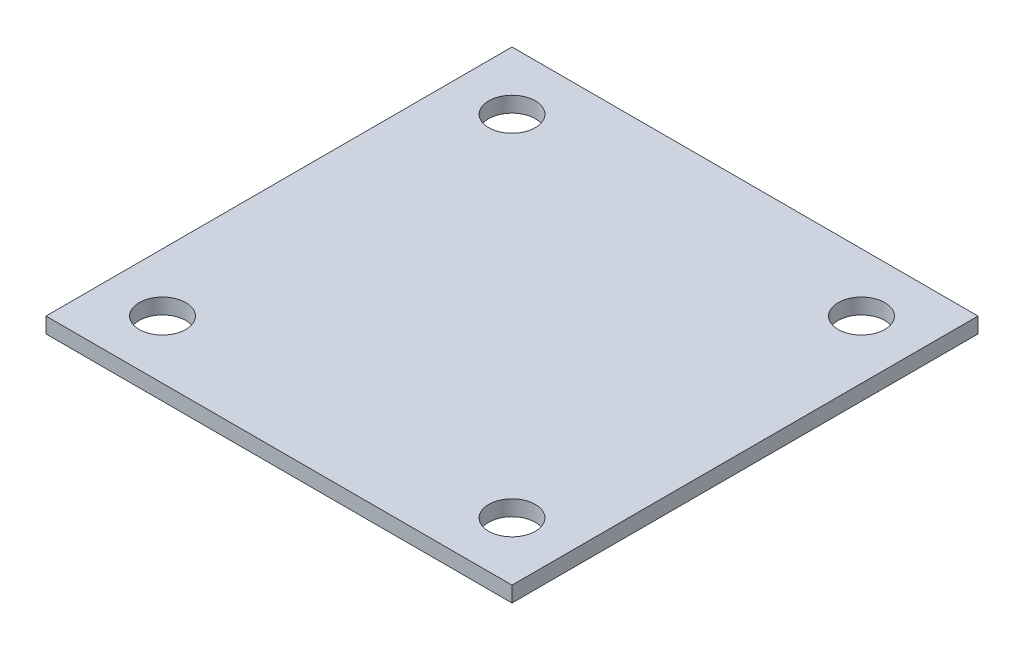
ISO-10303-21;
HEADER;
FILE_DESCRIPTION(('STEP AP214'),'2;1');
FILE_NAME('part.step','',(''),(''),'','','');
FILE_SCHEMA(('AUTOMOTIVE_DESIGN { 1 0 10303 214 1 1 1 1 }'));
ENDSEC;
DATA;
#1=APPLICATION_CONTEXT('core data for automotive mechanical design processes');
#2=APPLICATION_PROTOCOL_DEFINITION('international standard','automotive_design',2000,#1);
#3=PRODUCT_CONTEXT('',#1,'mechanical');
#4=PRODUCT('Part','Part','',(#3));
#5=PRODUCT_RELATED_PRODUCT_CATEGORY('part','',(#4));
#6=PRODUCT_DEFINITION_FORMATION('','',#4);
#7=PRODUCT_DEFINITION_CONTEXT('part definition',#1,'design');
#8=PRODUCT_DEFINITION('design','',#6,#7);
#9=PRODUCT_DEFINITION_SHAPE('','',#8);
#10=(LENGTH_UNIT() NAMED_UNIT(*) SI_UNIT(.MILLI.,.METRE.));
#11=(NAMED_UNIT(*) PLANE_ANGLE_UNIT() SI_UNIT($,.RADIAN.));
#12=(NAMED_UNIT(*) SI_UNIT($,.STERADIAN.) SOLID_ANGLE_UNIT());
#13=UNCERTAINTY_MEASURE_WITH_UNIT(LENGTH_MEASURE(1.E-05),#10,'distance_accuracy_value','');
#14=(GEOMETRIC_REPRESENTATION_CONTEXT(3) GLOBAL_UNCERTAINTY_ASSIGNED_CONTEXT((#13)) GLOBAL_UNIT_ASSIGNED_CONTEXT((#10,
#11,#12)) REPRESENTATION_CONTEXT('',''));
#15=CARTESIAN_POINT('',(0.,0.,0.));
#16=DIRECTION('',(0.,0.,1.));
#17=DIRECTION('',(1.,0.,0.));
#18=AXIS2_PLACEMENT_3D('',#15,#16,#17);
#19=CARTESIAN_POINT('',(30.,2.,-30.));
#20=DIRECTION('',(-1.,0.,0.));
#21=DIRECTION('',(0.,0.,1.));
#22=AXIS2_PLACEMENT_3D('',#19,#20,#21);
#23=PLANE('',#22);
#24=DIRECTION('',(0.,0.,-1.));
#25=VECTOR('',#24,1.);
#26=CARTESIAN_POINT('',(30.,0.,-30.));
#27=LINE('',#26,#25);
#28=CARTESIAN_POINT('',(30.,0.,30.));
#29=VERTEX_POINT('',#28);
#30=CARTESIAN_POINT('',(30.,0.,-30.));
#31=VERTEX_POINT('',#30);
#32=EDGE_CURVE('E96',#29,#31,#27,.T.);
#33=ORIENTED_EDGE('',*,*,#32,.T.);
#34=DIRECTION('',(0.,-1.,0.));
#35=VECTOR('',#34,1.);
#36=CARTESIAN_POINT('',(30.,2.,-30.));
#37=LINE('',#36,#35);
#38=CARTESIAN_POINT('',(30.,2.,-30.));
#39=VERTEX_POINT('',#38);
#40=EDGE_CURVE('E11',#39,#31,#37,.T.);
#41=ORIENTED_EDGE('',*,*,#40,.F.);
#42=DIRECTION('',(0.,0.,-1.));
#43=VECTOR('',#42,1.);
#44=CARTESIAN_POINT('',(30.,2.,-30.));
#45=LINE('',#44,#43);
#46=CARTESIAN_POINT('',(30.,2.,30.));
#47=VERTEX_POINT('',#46);
#48=EDGE_CURVE('E84',#47,#39,#45,.T.);
#49=ORIENTED_EDGE('',*,*,#48,.F.);
#50=DIRECTION('',(0.,-1.,0.));
#51=VECTOR('',#50,1.);
#52=CARTESIAN_POINT('',(30.,2.,30.));
#53=LINE('',#52,#51);
#54=EDGE_CURVE('E92',#47,#29,#53,.T.);
#55=ORIENTED_EDGE('',*,*,#54,.T.);
#56=EDGE_LOOP('',(#33,#41,#49,#55));
#57=FACE_BOUND('',#56,.T.);
#58=ADVANCED_FACE('F33',(#57),#23,.F.);
#59=CARTESIAN_POINT('',(-30.,2.,-30.));
#60=DIRECTION('',(0.,0.,1.));
#61=DIRECTION('',(1.,0.,0.));
#62=AXIS2_PLACEMENT_3D('',#59,#60,#61);
#63=PLANE('',#62);
#64=DIRECTION('',(-1.,0.,0.));
#65=VECTOR('',#64,1.);
#66=CARTESIAN_POINT('',(-30.,0.,-30.));
#67=LINE('',#66,#65);
#68=CARTESIAN_POINT('',(-30.,0.,-30.));
#69=VERTEX_POINT('',#68);
#70=EDGE_CURVE('E88',#31,#69,#67,.T.);
#71=ORIENTED_EDGE('',*,*,#70,.T.);
#72=DIRECTION('',(0.,-1.,0.));
#73=VECTOR('',#72,1.);
#74=CARTESIAN_POINT('',(-30.,2.,-30.));
#75=LINE('',#74,#73);
#76=CARTESIAN_POINT('',(-30.,2.,-30.));
#77=VERTEX_POINT('',#76);
#78=EDGE_CURVE('E41',#77,#69,#75,.T.);
#79=ORIENTED_EDGE('',*,*,#78,.F.);
#80=DIRECTION('',(-1.,0.,0.));
#81=VECTOR('',#80,1.);
#82=CARTESIAN_POINT('',(-30.,2.,-30.));
#83=LINE('',#82,#81);
#84=EDGE_CURVE('E79',#39,#77,#83,.T.);
#85=ORIENTED_EDGE('',*,*,#84,.F.);
#86=ORIENTED_EDGE('',*,*,#40,.T.);
#87=EDGE_LOOP('',(#71,#79,#85,#86));
#88=FACE_BOUND('',#87,.T.);
#89=ADVANCED_FACE('F87',(#88),#63,.F.);
#90=CARTESIAN_POINT('',(-30.,2.,-30.));
#91=DIRECTION('',(1.,0.,0.));
#92=DIRECTION('',(0.,0.,-1.));
#93=AXIS2_PLACEMENT_3D('',#90,#91,#92);
#94=PLANE('',#93);
#95=DIRECTION('',(0.,0.,1.));
#96=VECTOR('',#95,1.);
#97=CARTESIAN_POINT('',(-30.,0.,-30.));
#98=LINE('',#97,#96);
#99=CARTESIAN_POINT('',(-30.,0.,30.));
#100=VERTEX_POINT('',#99);
#101=EDGE_CURVE('E66',#69,#100,#98,.T.);
#102=ORIENTED_EDGE('',*,*,#101,.T.);
#103=DIRECTION('',(0.,-1.,0.));
#104=VECTOR('',#103,1.);
#105=CARTESIAN_POINT('',(-30.,2.,30.));
#106=LINE('',#105,#104);
#107=CARTESIAN_POINT('',(-30.,2.,30.));
#108=VERTEX_POINT('',#107);
#109=EDGE_CURVE('E89',#108,#100,#106,.T.);
#110=ORIENTED_EDGE('',*,*,#109,.F.);
#111=DIRECTION('',(0.,0.,1.));
#112=VECTOR('',#111,1.);
#113=CARTESIAN_POINT('',(-30.,2.,-30.));
#114=LINE('',#113,#112);
#115=EDGE_CURVE('E82',#77,#108,#114,.T.);
#116=ORIENTED_EDGE('',*,*,#115,.F.);
#117=ORIENTED_EDGE('',*,*,#78,.T.);
#118=EDGE_LOOP('',(#102,#110,#116,#117));
#119=FACE_BOUND('',#118,.T.);
#120=ADVANCED_FACE('F90',(#119),#94,.F.);
#121=CARTESIAN_POINT('',(-30.,2.,30.));
#122=DIRECTION('',(0.,0.,-1.));
#123=DIRECTION('',(-1.,0.,0.));
#124=AXIS2_PLACEMENT_3D('',#121,#122,#123);
#125=PLANE('',#124);
#126=DIRECTION('',(1.,0.,0.));
#127=VECTOR('',#126,1.);
#128=CARTESIAN_POINT('',(-30.,0.,30.));
#129=LINE('',#128,#127);
#130=EDGE_CURVE('E72',#100,#29,#129,.T.);
#131=ORIENTED_EDGE('',*,*,#130,.T.);
#132=ORIENTED_EDGE('',*,*,#54,.F.);
#133=DIRECTION('',(1.,0.,0.));
#134=VECTOR('',#133,1.);
#135=CARTESIAN_POINT('',(-30.,2.,30.));
#136=LINE('',#135,#134);
#137=EDGE_CURVE('E49',#108,#47,#136,.T.);
#138=ORIENTED_EDGE('',*,*,#137,.F.);
#139=ORIENTED_EDGE('',*,*,#109,.T.);
#140=EDGE_LOOP('',(#131,#132,#138,#139));
#141=FACE_BOUND('',#140,.T.);
#142=ADVANCED_FACE('F104',(#141),#125,.F.);
#143=CARTESIAN_POINT('',(0.,2.,0.));
#144=DIRECTION('',(0.,1.,0.));
#145=DIRECTION('',(0.,0.,1.));
#146=AXIS2_PLACEMENT_3D('',#143,#144,#145);
#147=PLANE('',#146);
#148=CARTESIAN_POINT('',(22.5,2.,-22.5));
#149=DIRECTION('',(0.,1.,0.));
#150=DIRECTION('',(0.,0.,1.));
#151=AXIS2_PLACEMENT_3D('',#148,#149,#150);
#152=CIRCLE('',#151,3.);
#153=CARTESIAN_POINT('',(22.5,2.,-19.5));
#154=VERTEX_POINT('',#153);
#155=EDGE_CURVE('E123',#154,#154,#152,.T.);
#156=ORIENTED_EDGE('',*,*,#155,.F.);
#157=EDGE_LOOP('',(#156));
#158=FACE_BOUND('',#157,.T.);
#159=CARTESIAN_POINT('',(-22.4999999999995,2.,22.5));
#160=DIRECTION('',(0.,1.,0.));
#161=DIRECTION('',(0.,0.,1.));
#162=AXIS2_PLACEMENT_3D('',#159,#160,#161);
#163=CIRCLE('',#162,3.);
#164=CARTESIAN_POINT('',(-22.4999999999995,2.,25.5));
#165=VERTEX_POINT('',#164);
#166=EDGE_CURVE('E116',#165,#165,#163,.T.);
#167=ORIENTED_EDGE('',*,*,#166,.F.);
#168=EDGE_LOOP('',(#167));
#169=FACE_BOUND('',#168,.T.);
#170=CARTESIAN_POINT('',(22.5000000000005,2.,22.5));
#171=DIRECTION('',(0.,1.,0.));
#172=DIRECTION('',(0.,0.,1.));
#173=AXIS2_PLACEMENT_3D('',#170,#171,#172);
#174=CIRCLE('',#173,3.);
#175=CARTESIAN_POINT('',(22.5000000000005,2.,25.5));
#176=VERTEX_POINT('',#175);
#177=EDGE_CURVE('E128',#176,#176,#174,.T.);
#178=ORIENTED_EDGE('',*,*,#177,.F.);
#179=EDGE_LOOP('',(#178));
#180=FACE_BOUND('',#179,.T.);
#181=CARTESIAN_POINT('',(-22.5,2.,-22.5));
#182=DIRECTION('',(0.,1.,0.));
#183=DIRECTION('',(0.,0.,1.));
#184=AXIS2_PLACEMENT_3D('',#181,#182,#183);
#185=CIRCLE('',#184,3.);
#186=CARTESIAN_POINT('',(-22.5,2.,-19.5));
#187=VERTEX_POINT('',#186);
#188=EDGE_CURVE('E110',#187,#187,#185,.T.);
#189=ORIENTED_EDGE('',*,*,#188,.F.);
#190=EDGE_LOOP('',(#189));
#191=FACE_BOUND('',#190,.T.);
#192=ORIENTED_EDGE('',*,*,#48,.T.);
#193=ORIENTED_EDGE('',*,*,#84,.T.);
#194=ORIENTED_EDGE('',*,*,#115,.T.);
#195=ORIENTED_EDGE('',*,*,#137,.T.);
#196=EDGE_LOOP('',(#192,#193,#194,#195));
#197=FACE_BOUND('',#196,.T.);
#198=ADVANCED_FACE('F80',(#158,#169,#180,#191,#197),#147,.T.);
#199=CARTESIAN_POINT('',(0.,0.,0.));
#200=DIRECTION('',(0.,1.,0.));
#201=DIRECTION('',(0.,0.,1.));
#202=AXIS2_PLACEMENT_3D('',#199,#200,#201);
#203=PLANE('',#202);
#204=CARTESIAN_POINT('',(22.5,0.,-22.5));
#205=DIRECTION('',(0.,1.,0.));
#206=DIRECTION('',(0.,0.,1.));
#207=AXIS2_PLACEMENT_3D('',#204,#205,#206);
#208=CIRCLE('',#207,3.);
#209=CARTESIAN_POINT('',(22.5,0.,-19.5));
#210=VERTEX_POINT('',#209);
#211=EDGE_CURVE('E113',#210,#210,#208,.T.);
#212=ORIENTED_EDGE('',*,*,#211,.T.);
#213=EDGE_LOOP('',(#212));
#214=FACE_BOUND('',#213,.T.);
#215=CARTESIAN_POINT('',(-22.4999999999995,0.,22.5));
#216=DIRECTION('',(0.,1.,0.));
#217=DIRECTION('',(0.,0.,1.));
#218=AXIS2_PLACEMENT_3D('',#215,#216,#217);
#219=CIRCLE('',#218,3.);
#220=CARTESIAN_POINT('',(-22.4999999999995,0.,25.5));
#221=VERTEX_POINT('',#220);
#222=EDGE_CURVE('E119',#221,#221,#219,.T.);
#223=ORIENTED_EDGE('',*,*,#222,.T.);
#224=EDGE_LOOP('',(#223));
#225=FACE_BOUND('',#224,.T.);
#226=CARTESIAN_POINT('',(22.5000000000005,0.,22.5));
#227=DIRECTION('',(0.,1.,0.));
#228=DIRECTION('',(0.,0.,1.));
#229=AXIS2_PLACEMENT_3D('',#226,#227,#228);
#230=CIRCLE('',#229,3.);
#231=CARTESIAN_POINT('',(22.5000000000005,0.,25.5));
#232=VERTEX_POINT('',#231);
#233=EDGE_CURVE('E120',#232,#232,#230,.T.);
#234=ORIENTED_EDGE('',*,*,#233,.T.);
#235=EDGE_LOOP('',(#234));
#236=FACE_BOUND('',#235,.T.);
#237=CARTESIAN_POINT('',(-22.5,0.,-22.5));
#238=DIRECTION('',(0.,1.,0.));
#239=DIRECTION('',(0.,0.,1.));
#240=AXIS2_PLACEMENT_3D('',#237,#238,#239);
#241=CIRCLE('',#240,3.);
#242=CARTESIAN_POINT('',(-22.5,0.,-19.5));
#243=VERTEX_POINT('',#242);
#244=EDGE_CURVE('E99',#243,#243,#241,.T.);
#245=ORIENTED_EDGE('',*,*,#244,.T.);
#246=EDGE_LOOP('',(#245));
#247=FACE_BOUND('',#246,.T.);
#248=ORIENTED_EDGE('',*,*,#32,.F.);
#249=ORIENTED_EDGE('',*,*,#130,.F.);
#250=ORIENTED_EDGE('',*,*,#101,.F.);
#251=ORIENTED_EDGE('',*,*,#70,.F.);
#252=EDGE_LOOP('',(#248,#249,#250,#251));
#253=FACE_BOUND('',#252,.T.);
#254=ADVANCED_FACE('F107',(#214,#225,#236,#247,#253),#203,.F.);
#255=CARTESIAN_POINT('',(-22.5,0.,-22.5));
#256=DIRECTION('',(0.,1.,0.));
#257=DIRECTION('',(0.,0.,1.));
#258=AXIS2_PLACEMENT_3D('',#255,#256,#257);
#259=CYLINDRICAL_SURFACE('',#258,3.);
#260=ORIENTED_EDGE('',*,*,#244,.F.);
#261=EDGE_LOOP('',(#260));
#262=FACE_BOUND('',#261,.T.);
#263=ORIENTED_EDGE('',*,*,#188,.T.);
#264=EDGE_LOOP('',(#263));
#265=FACE_BOUND('',#264,.T.);
#266=ADVANCED_FACE('F140',(#262,#265),#259,.F.);
#267=CARTESIAN_POINT('',(22.5000000000005,0.,22.5));
#268=DIRECTION('',(0.,1.,0.));
#269=DIRECTION('',(0.,0.,1.));
#270=AXIS2_PLACEMENT_3D('',#267,#268,#269);
#271=CYLINDRICAL_SURFACE('',#270,3.);
#272=ORIENTED_EDGE('',*,*,#233,.F.);
#273=EDGE_LOOP('',(#272));
#274=FACE_BOUND('',#273,.T.);
#275=ORIENTED_EDGE('',*,*,#177,.T.);
#276=EDGE_LOOP('',(#275));
#277=FACE_BOUND('',#276,.T.);
#278=ADVANCED_FACE('F136',(#274,#277),#271,.F.);
#279=CARTESIAN_POINT('',(-22.4999999999995,0.,22.5));
#280=DIRECTION('',(0.,1.,0.));
#281=DIRECTION('',(0.,0.,1.));
#282=AXIS2_PLACEMENT_3D('',#279,#280,#281);
#283=CYLINDRICAL_SURFACE('',#282,3.);
#284=ORIENTED_EDGE('',*,*,#222,.F.);
#285=EDGE_LOOP('',(#284));
#286=FACE_BOUND('',#285,.T.);
#287=ORIENTED_EDGE('',*,*,#166,.T.);
#288=EDGE_LOOP('',(#287));
#289=FACE_BOUND('',#288,.T.);
#290=ADVANCED_FACE('F139',(#286,#289),#283,.F.);
#291=CARTESIAN_POINT('',(22.5,0.,-22.5));
#292=DIRECTION('',(0.,1.,0.));
#293=DIRECTION('',(0.,0.,1.));
#294=AXIS2_PLACEMENT_3D('',#291,#292,#293);
#295=CYLINDRICAL_SURFACE('',#294,3.);
#296=ORIENTED_EDGE('',*,*,#211,.F.);
#297=EDGE_LOOP('',(#296));
#298=FACE_BOUND('',#297,.T.);
#299=ORIENTED_EDGE('',*,*,#155,.T.);
#300=EDGE_LOOP('',(#299));
#301=FACE_BOUND('',#300,.T.);
#302=ADVANCED_FACE('F201',(#298,#301),#295,.F.);
#303=CLOSED_SHELL('',(#58,#89,#120,#142,#198,#254,#266,#278,#290,#302));
#304=MANIFOLD_SOLID_BREP('B2',#303);
#305=ADVANCED_BREP_SHAPE_REPRESENTATION('',(#18,#304),#14);
#306=SHAPE_DEFINITION_REPRESENTATION(#9,#305);
ENDSEC;
END-ISO-10303-21;
